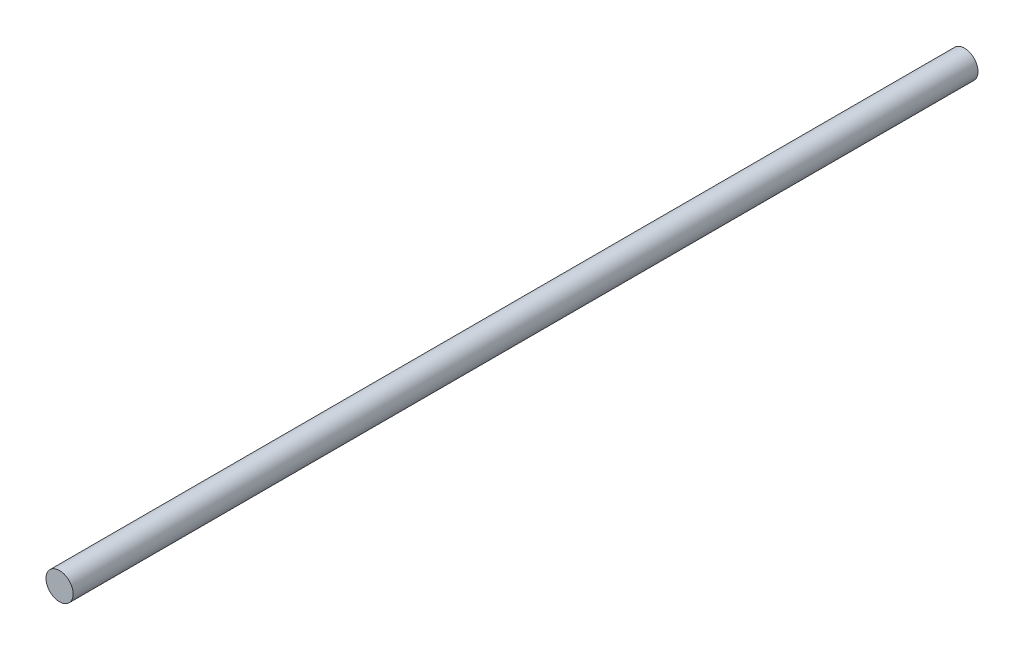
ISO-10303-21;
HEADER;
FILE_DESCRIPTION(('STEP AP214'),'2;1');
FILE_NAME('part.step','',(''),(''),'','','');
FILE_SCHEMA(('AUTOMOTIVE_DESIGN { 1 0 10303 214 1 1 1 1 }'));
ENDSEC;
DATA;
#1=APPLICATION_CONTEXT('core data for automotive mechanical design processes');
#2=APPLICATION_PROTOCOL_DEFINITION('international standard','automotive_design',2000,#1);
#3=PRODUCT_CONTEXT('',#1,'mechanical');
#4=PRODUCT('Part','Part','',(#3));
#5=PRODUCT_RELATED_PRODUCT_CATEGORY('part','',(#4));
#6=PRODUCT_DEFINITION_FORMATION('','',#4);
#7=PRODUCT_DEFINITION_CONTEXT('part definition',#1,'design');
#8=PRODUCT_DEFINITION('design','',#6,#7);
#9=PRODUCT_DEFINITION_SHAPE('','',#8);
#10=(LENGTH_UNIT() NAMED_UNIT(*) SI_UNIT(.MILLI.,.METRE.));
#11=(NAMED_UNIT(*) PLANE_ANGLE_UNIT() SI_UNIT($,.RADIAN.));
#12=(NAMED_UNIT(*) SI_UNIT($,.STERADIAN.) SOLID_ANGLE_UNIT());
#13=UNCERTAINTY_MEASURE_WITH_UNIT(LENGTH_MEASURE(1.E-05),#10,'distance_accuracy_value','');
#14=(GEOMETRIC_REPRESENTATION_CONTEXT(3) GLOBAL_UNCERTAINTY_ASSIGNED_CONTEXT((#13)) GLOBAL_UNIT_ASSIGNED_CONTEXT((#10,
#11,#12)) REPRESENTATION_CONTEXT('',''));
#15=CARTESIAN_POINT('',(0.,0.,0.));
#16=DIRECTION('',(0.,0.,1.));
#17=DIRECTION('',(1.,0.,0.));
#18=AXIS2_PLACEMENT_3D('',#15,#16,#17);
#19=CARTESIAN_POINT('',(0.,0.,-317.5));
#20=DIRECTION('',(0.,0.,1.));
#21=DIRECTION('',(1.,0.,0.));
#22=AXIS2_PLACEMENT_3D('',#19,#20,#21);
#23=CYLINDRICAL_SURFACE('',#22,4.7625);
#24=CARTESIAN_POINT('',(0.,0.,-317.5));
#25=DIRECTION('',(0.,0.,1.));
#26=DIRECTION('',(1.,0.,0.));
#27=AXIS2_PLACEMENT_3D('',#24,#25,#26);
#28=CIRCLE('',#27,4.7625);
#29=CARTESIAN_POINT('',(4.7625,0.,-317.5));
#30=VERTEX_POINT('',#29);
#31=EDGE_CURVE('E10',#30,#30,#28,.T.);
#32=ORIENTED_EDGE('',*,*,#31,.T.);
#33=EDGE_LOOP('',(#32));
#34=FACE_BOUND('',#33,.T.);
#35=CARTESIAN_POINT('',(0.,0.,0.));
#36=DIRECTION('',(0.,0.,1.));
#37=DIRECTION('',(1.,0.,0.));
#38=AXIS2_PLACEMENT_3D('',#35,#36,#37);
#39=CIRCLE('',#38,4.7625);
#40=CARTESIAN_POINT('',(4.7625,0.,0.));
#41=VERTEX_POINT('',#40);
#42=EDGE_CURVE('E36',#41,#41,#39,.T.);
#43=ORIENTED_EDGE('',*,*,#42,.F.);
#44=EDGE_LOOP('',(#43));
#45=FACE_BOUND('',#44,.T.);
#46=ADVANCED_FACE('F33',(#34,#45),#23,.T.);
#47=CARTESIAN_POINT('',(0.,0.,-317.5));
#48=DIRECTION('',(0.,0.,1.));
#49=DIRECTION('',(1.,0.,0.));
#50=AXIS2_PLACEMENT_3D('',#47,#48,#49);
#51=PLANE('',#50);
#52=ORIENTED_EDGE('',*,*,#31,.F.);
#53=EDGE_LOOP('',(#52));
#54=FACE_BOUND('',#53,.T.);
#55=ADVANCED_FACE('F49',(#54),#51,.F.);
#56=CARTESIAN_POINT('',(0.,0.,0.));
#57=DIRECTION('',(0.,0.,1.));
#58=DIRECTION('',(1.,0.,0.));
#59=AXIS2_PLACEMENT_3D('',#56,#57,#58);
#60=PLANE('',#59);
#61=ORIENTED_EDGE('',*,*,#42,.T.);
#62=EDGE_LOOP('',(#61));
#63=FACE_BOUND('',#62,.T.);
#64=ADVANCED_FACE('F46',(#63),#60,.T.);
#65=CLOSED_SHELL('',(#46,#55,#64));
#66=MANIFOLD_SOLID_BREP('B2',#65);
#67=ADVANCED_BREP_SHAPE_REPRESENTATION('',(#18,#66),#14);
#68=SHAPE_DEFINITION_REPRESENTATION(#9,#67);
ENDSEC;
END-ISO-10303-21;
